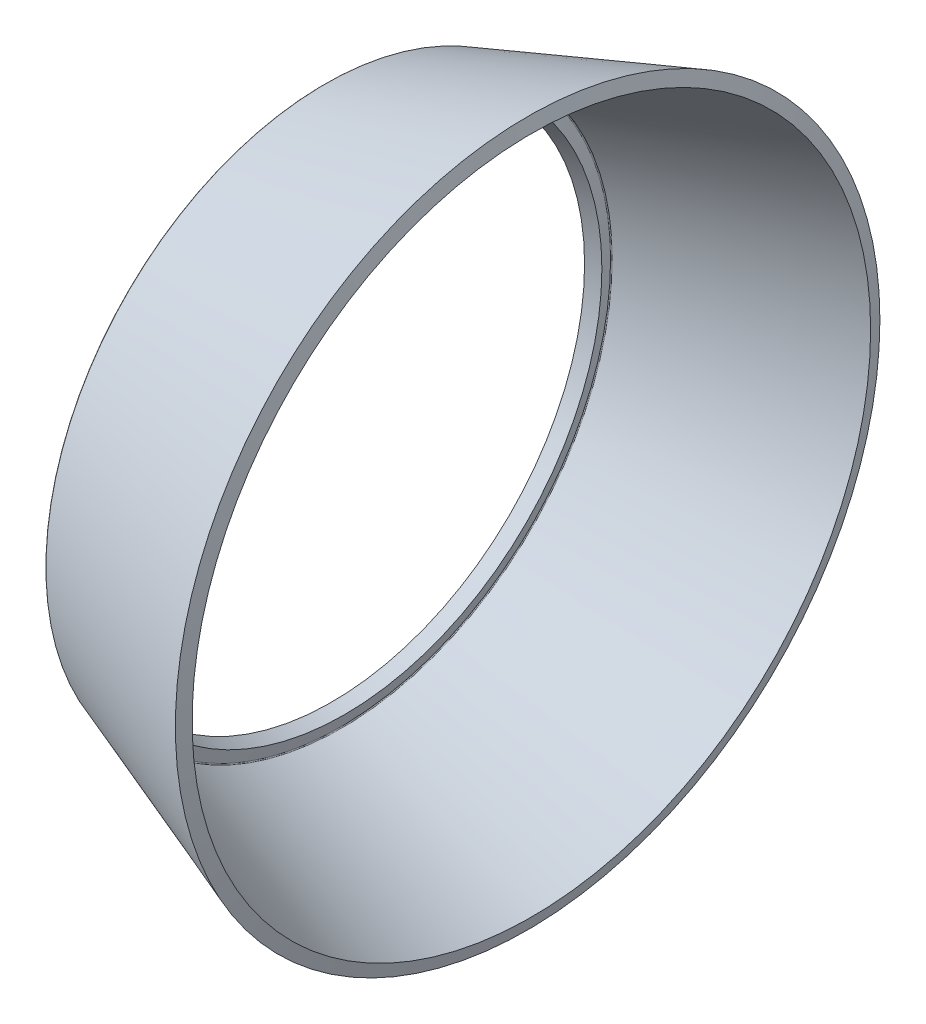
ISO-10303-21;
HEADER;
FILE_DESCRIPTION(('STEP AP214'),'2;1');
FILE_NAME('part.step','',(''),(''),'','','');
FILE_SCHEMA(('AUTOMOTIVE_DESIGN { 1 0 10303 214 1 1 1 1 }'));
ENDSEC;
DATA;
#1=APPLICATION_CONTEXT('core data for automotive mechanical design processes');
#2=APPLICATION_PROTOCOL_DEFINITION('international standard','automotive_design',2000,#1);
#3=PRODUCT_CONTEXT('',#1,'mechanical');
#4=PRODUCT('Part','Part','',(#3));
#5=PRODUCT_RELATED_PRODUCT_CATEGORY('part','',(#4));
#6=PRODUCT_DEFINITION_FORMATION('','',#4);
#7=PRODUCT_DEFINITION_CONTEXT('part definition',#1,'design');
#8=PRODUCT_DEFINITION('design','',#6,#7);
#9=PRODUCT_DEFINITION_SHAPE('','',#8);
#10=(LENGTH_UNIT() NAMED_UNIT(*) SI_UNIT(.MILLI.,.METRE.));
#11=(NAMED_UNIT(*) PLANE_ANGLE_UNIT() SI_UNIT($,.RADIAN.));
#12=(NAMED_UNIT(*) SI_UNIT($,.STERADIAN.) SOLID_ANGLE_UNIT());
#13=UNCERTAINTY_MEASURE_WITH_UNIT(LENGTH_MEASURE(1.E-05),#10,'distance_accuracy_value','');
#14=(GEOMETRIC_REPRESENTATION_CONTEXT(3) GLOBAL_UNCERTAINTY_ASSIGNED_CONTEXT((#13)) GLOBAL_UNIT_ASSIGNED_CONTEXT((#10,
#11,#12)) REPRESENTATION_CONTEXT('',''));
#15=CARTESIAN_POINT('',(0.,0.,0.));
#16=DIRECTION('',(0.,0.,1.));
#17=DIRECTION('',(1.,0.,0.));
#18=AXIS2_PLACEMENT_3D('',#15,#16,#17);
#19=CARTESIAN_POINT('',(14.1007174802533,0.,0.));
#20=DIRECTION('',(1.,0.,0.));
#21=DIRECTION('',(0.,0.,-1.));
#22=AXIS2_PLACEMENT_3D('',#19,#20,#21);
#23=CONICAL_SURFACE('',#22,26.1232031002109,0.346151150548035);
#24=CARTESIAN_POINT('',(-0.896016256809899,0.,0.));
#25=DIRECTION('',(1.,0.,0.));
#26=DIRECTION('',(0.,0.,-1.));
#27=AXIS2_PLACEMENT_3D('',#24,#25,#26);
#28=CIRCLE('',#27,20.714287649935);
#29=CARTESIAN_POINT('',(-0.896016256809899,0.,-20.714287649935));
#30=VERTEX_POINT('',#29);
#31=EDGE_CURVE('E10',#30,#30,#28,.T.);
#32=ORIENTED_EDGE('',*,*,#31,.T.);
#33=EDGE_LOOP('',(#32));
#34=FACE_BOUND('',#33,.T.);
#35=CARTESIAN_POINT('',(14.1007174802533,0.,0.));
#36=DIRECTION('',(1.,0.,0.));
#37=DIRECTION('',(0.,0.,-1.));
#38=AXIS2_PLACEMENT_3D('',#35,#36,#37);
#39=CIRCLE('',#38,26.1232031002109);
#40=CARTESIAN_POINT('',(14.1007174802533,0.,-26.1232031002109));
#41=VERTEX_POINT('',#40);
#42=EDGE_CURVE('E43',#41,#41,#39,.T.);
#43=ORIENTED_EDGE('',*,*,#42,.F.);
#44=EDGE_LOOP('',(#43));
#45=FACE_BOUND('',#44,.T.);
#46=ADVANCED_FACE('F15',(#34,#45),#23,.T.);
#47=CARTESIAN_POINT('',(-0.862088279564769,0.,0.));
#48=DIRECTION('',(1.,0.,0.));
#49=DIRECTION('',(0.,0.,-1.));
#50=AXIS2_PLACEMENT_3D('',#47,#48,#49);
#51=TOROIDAL_SURFACE('',#50,20.620219098548,0.100000000000001);
#52=CARTESIAN_POINT('',(-0.958214449158598,0.,0.));
#53=DIRECTION('',(1.,0.,0.));
#54=DIRECTION('',(0.,0.,-1.));
#55=AXIS2_PLACEMENT_3D('',#52,#53,#54);
#56=CIRCLE('',#55,20.5926553629663);
#57=CARTESIAN_POINT('',(-0.958214449158598,0.,-20.5926553629663));
#58=VERTEX_POINT('',#57);
#59=EDGE_CURVE('E21',#58,#58,#56,.T.);
#60=ORIENTED_EDGE('',*,*,#59,.T.);
#61=EDGE_LOOP('',(#60));
#62=FACE_BOUND('',#61,.T.);
#63=ORIENTED_EDGE('',*,*,#31,.F.);
#64=EDGE_LOOP('',(#63));
#65=FACE_BOUND('',#64,.T.);
#66=ADVANCED_FACE('F51',(#62,#65),#51,.T.);
#67=CARTESIAN_POINT('',(-0.958214449158598,0.,0.));
#68=DIRECTION('',(-1.,0.,0.));
#69=DIRECTION('',(0.,0.,1.));
#70=AXIS2_PLACEMENT_3D('',#67,#68,#69);
#71=CONICAL_SURFACE('',#70,20.5926553629663,1.29154364647581);
#72=CARTESIAN_POINT('',(-0.431482646839232,0.,0.));
#73=DIRECTION('',(1.,0.,0.));
#74=DIRECTION('',(0.,0.,-1.));
#75=AXIS2_PLACEMENT_3D('',#72,#73,#74);
#76=CIRCLE('',#75,18.7557232675273);
#77=CARTESIAN_POINT('',(-0.431482646839232,0.,-18.7557232675273));
#78=VERTEX_POINT('',#77);
#79=EDGE_CURVE('E25',#78,#78,#76,.T.);
#80=ORIENTED_EDGE('',*,*,#79,.T.);
#81=EDGE_LOOP('',(#80));
#82=FACE_BOUND('',#81,.T.);
#83=ORIENTED_EDGE('',*,*,#59,.F.);
#84=EDGE_LOOP('',(#83));
#85=FACE_BOUND('',#84,.T.);
#86=ADVANCED_FACE('F56',(#82,#85),#71,.F.);
#87=CARTESIAN_POINT('',(-0.431482646839232,0.,0.));
#88=DIRECTION('',(1.,0.,0.));
#89=DIRECTION('',(0.,0.,-1.));
#90=AXIS2_PLACEMENT_3D('',#87,#88,#89);
#91=CONICAL_SURFACE('',#90,18.7557232675273,0.346151150548033);
#92=CARTESIAN_POINT('',(0.511311773919942,0.,0.));
#93=DIRECTION('',(1.,0.,0.));
#94=DIRECTION('',(0.,0.,-1.));
#95=AXIS2_PLACEMENT_3D('',#92,#93,#94);
#96=CIRCLE('',#95,19.0957636655425);
#97=CARTESIAN_POINT('',(0.511311773919942,0.,-19.0957636655425));
#98=VERTEX_POINT('',#97);
#99=EDGE_CURVE('E29',#98,#98,#96,.T.);
#100=ORIENTED_EDGE('',*,*,#99,.T.);
#101=EDGE_LOOP('',(#100));
#102=FACE_BOUND('',#101,.T.);
#103=ORIENTED_EDGE('',*,*,#79,.F.);
#104=EDGE_LOOP('',(#103));
#105=FACE_BOUND('',#104,.T.);
#106=ADVANCED_FACE('F60',(#102,#105),#91,.F.);
#107=CARTESIAN_POINT('',(0.511311773919942,0.,0.));
#108=DIRECTION('',(-1.,0.,0.));
#109=DIRECTION('',(0.,0.,1.));
#110=AXIS2_PLACEMENT_3D('',#107,#108,#109);
#111=CONICAL_SURFACE('',#110,19.0957636655425,1.2915436464758);
#112=CARTESIAN_POINT('',(0.252242339882719,0.,0.));
#113=DIRECTION('',(1.,0.,0.));
#114=DIRECTION('',(0.,0.,-1.));
#115=AXIS2_PLACEMENT_3D('',#112,#113,#114);
#116=CIRCLE('',#115,19.9992461517616);
#117=CARTESIAN_POINT('',(0.252242339882719,0.,-19.9992461517616));
#118=VERTEX_POINT('',#117);
#119=EDGE_CURVE('E34',#118,#118,#116,.T.);
#120=ORIENTED_EDGE('',*,*,#119,.T.);
#121=EDGE_LOOP('',(#120));
#122=FACE_BOUND('',#121,.T.);
#123=ORIENTED_EDGE('',*,*,#99,.F.);
#124=EDGE_LOOP('',(#123));
#125=FACE_BOUND('',#124,.T.);
#126=ADVANCED_FACE('F67',(#122,#125),#111,.T.);
#127=CARTESIAN_POINT('',(0.31632645294527,0.,0.));
#128=DIRECTION('',(1.,0.,0.));
#129=DIRECTION('',(0.,0.,-1.));
#130=AXIS2_PLACEMENT_3D('',#127,#128,#129);
#131=TOROIDAL_SURFACE('',#130,20.0176219754827,0.0666666666666631);
#132=ORIENTED_EDGE('',*,*,#119,.F.);
#133=EDGE_LOOP('',(#132));
#134=FACE_BOUND('',#133,.T.);
#135=CARTESIAN_POINT('',(0.293707801448523,0.,0.));
#136=DIRECTION('',(1.,0.,0.));
#137=DIRECTION('',(0.,0.,-1.));
#138=AXIS2_PLACEMENT_3D('',#135,#136,#137);
#139=CIRCLE('',#138,20.0803343430741);
#140=CARTESIAN_POINT('',(0.293707801448523,0.,-20.0803343430741));
#141=VERTEX_POINT('',#140);
#142=EDGE_CURVE('E37',#141,#141,#139,.T.);
#143=ORIENTED_EDGE('',*,*,#142,.T.);
#144=EDGE_LOOP('',(#143));
#145=FACE_BOUND('',#144,.T.);
#146=ADVANCED_FACE('F71',(#134,#145),#131,.F.);
#147=CARTESIAN_POINT('',(0.293707801448523,0.,0.));
#148=DIRECTION('',(1.,0.,0.));
#149=DIRECTION('',(0.,0.,-1.));
#150=AXIS2_PLACEMENT_3D('',#147,#148,#149);
#151=CONICAL_SURFACE('',#150,20.0803343430741,0.346151150548036);
#152=CARTESIAN_POINT('',(14.3769727827804,0.,0.));
#153=DIRECTION('',(1.,0.,0.));
#154=DIRECTION('',(0.,0.,-1.));
#155=AXIS2_PLACEMENT_3D('',#152,#153,#154);
#156=CIRCLE('',#155,25.1597863679904);
#157=CARTESIAN_POINT('',(14.3769727827804,0.,-25.1597863679904));
#158=VERTEX_POINT('',#157);
#159=EDGE_CURVE('E40',#158,#158,#156,.T.);
#160=ORIENTED_EDGE('',*,*,#159,.T.);
#161=EDGE_LOOP('',(#160));
#162=FACE_BOUND('',#161,.T.);
#163=ORIENTED_EDGE('',*,*,#142,.F.);
#164=EDGE_LOOP('',(#163));
#165=FACE_BOUND('',#164,.T.);
#166=ADVANCED_FACE('F75',(#162,#165),#151,.F.);
#167=CARTESIAN_POINT('',(14.3769727827804,0.,0.));
#168=DIRECTION('',(-1.,0.,0.));
#169=DIRECTION('',(0.,0.,1.));
#170=AXIS2_PLACEMENT_3D('',#167,#168,#169);
#171=CONICAL_SURFACE('',#170,25.1597863679904,1.2915436464758);
#172=ORIENTED_EDGE('',*,*,#42,.T.);
#173=EDGE_LOOP('',(#172));
#174=FACE_BOUND('',#173,.T.);
#175=ORIENTED_EDGE('',*,*,#159,.F.);
#176=EDGE_LOOP('',(#175));
#177=FACE_BOUND('',#176,.T.);
#178=ADVANCED_FACE('F47',(#174,#177),#171,.T.);
#179=CLOSED_SHELL('',(#46,#66,#86,#106,#126,#146,#166,#178));
#180=MANIFOLD_SOLID_BREP('B1',#179);
#181=ADVANCED_BREP_SHAPE_REPRESENTATION('',(#18,#180),#14);
#182=SHAPE_DEFINITION_REPRESENTATION(#9,#181);
ENDSEC;
END-ISO-10303-21;
